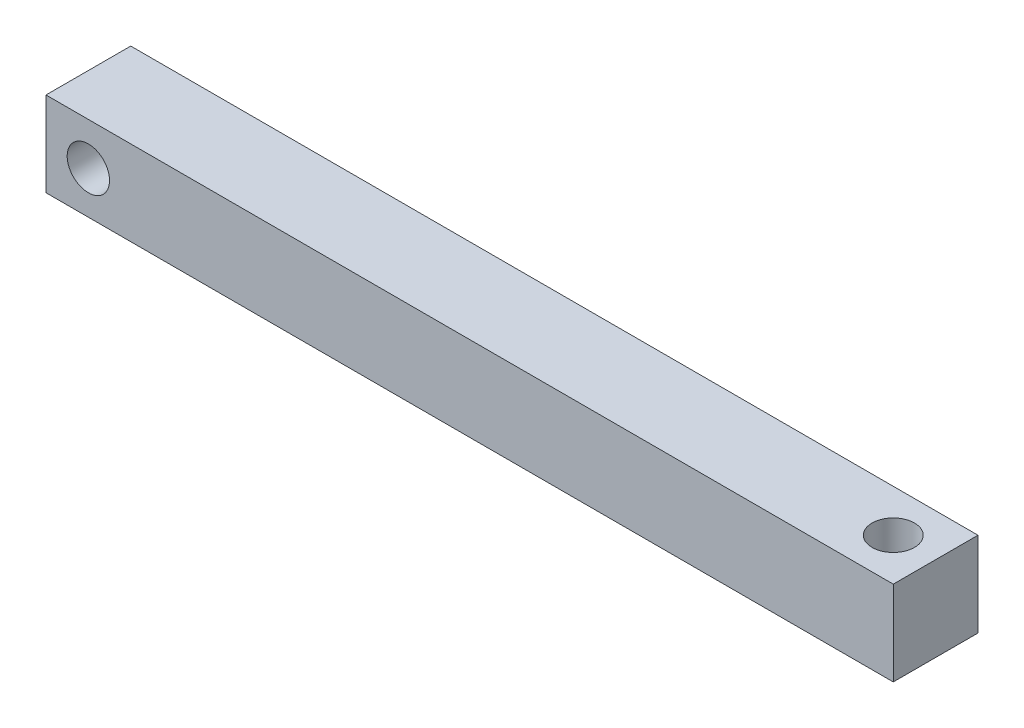
ISO-10303-21;
HEADER;
FILE_DESCRIPTION(('STEP AP214'),'2;1');
FILE_NAME('part.step','',(''),(''),'','','');
FILE_SCHEMA(('AUTOMOTIVE_DESIGN { 1 0 10303 214 1 1 1 1 }'));
ENDSEC;
DATA;
#1=APPLICATION_CONTEXT('core data for automotive mechanical design processes');
#2=APPLICATION_PROTOCOL_DEFINITION('international standard','automotive_design',2000,#1);
#3=PRODUCT_CONTEXT('',#1,'mechanical');
#4=PRODUCT('Part','Part','',(#3));
#5=PRODUCT_RELATED_PRODUCT_CATEGORY('part','',(#4));
#6=PRODUCT_DEFINITION_FORMATION('','',#4);
#7=PRODUCT_DEFINITION_CONTEXT('part definition',#1,'design');
#8=PRODUCT_DEFINITION('design','',#6,#7);
#9=PRODUCT_DEFINITION_SHAPE('','',#8);
#10=(LENGTH_UNIT() NAMED_UNIT(*) SI_UNIT(.MILLI.,.METRE.));
#11=(NAMED_UNIT(*) PLANE_ANGLE_UNIT() SI_UNIT($,.RADIAN.));
#12=(NAMED_UNIT(*) SI_UNIT($,.STERADIAN.) SOLID_ANGLE_UNIT());
#13=UNCERTAINTY_MEASURE_WITH_UNIT(LENGTH_MEASURE(1.E-05),#10,'distance_accuracy_value','');
#14=(GEOMETRIC_REPRESENTATION_CONTEXT(3) GLOBAL_UNCERTAINTY_ASSIGNED_CONTEXT((#13)) GLOBAL_UNIT_ASSIGNED_CONTEXT((#10,
#11,#12)) REPRESENTATION_CONTEXT('',''));
#15=CARTESIAN_POINT('',(0.,0.,0.));
#16=DIRECTION('',(0.,0.,1.));
#17=DIRECTION('',(1.,0.,0.));
#18=AXIS2_PLACEMENT_3D('',#15,#16,#17);
#19=CARTESIAN_POINT('',(100.,10.,20.));
#20=DIRECTION('',(-1.,0.,0.));
#21=DIRECTION('',(0.,-1.,0.));
#22=AXIS2_PLACEMENT_3D('',#19,#20,#21);
#23=PLANE('',#22);
#24=DIRECTION('',(0.,1.,0.));
#25=VECTOR('',#24,1.);
#26=CARTESIAN_POINT('',(100.,10.,0.));
#27=LINE('',#26,#25);
#28=CARTESIAN_POINT('',(100.,-10.,0.));
#29=VERTEX_POINT('',#28);
#30=CARTESIAN_POINT('',(100.,10.,0.));
#31=VERTEX_POINT('',#30);
#32=EDGE_CURVE('E103',#29,#31,#27,.T.);
#33=ORIENTED_EDGE('',*,*,#32,.T.);
#34=DIRECTION('',(0.,0.,-1.));
#35=VECTOR('',#34,1.);
#36=CARTESIAN_POINT('',(100.,10.,20.));
#37=LINE('',#36,#35);
#38=CARTESIAN_POINT('',(100.,10.,20.));
#39=VERTEX_POINT('',#38);
#40=EDGE_CURVE('E11',#39,#31,#37,.T.);
#41=ORIENTED_EDGE('',*,*,#40,.F.);
#42=DIRECTION('',(0.,1.,0.));
#43=VECTOR('',#42,1.);
#44=CARTESIAN_POINT('',(100.,10.,20.));
#45=LINE('',#44,#43);
#46=CARTESIAN_POINT('',(100.,-10.,20.));
#47=VERTEX_POINT('',#46);
#48=EDGE_CURVE('E91',#47,#39,#45,.T.);
#49=ORIENTED_EDGE('',*,*,#48,.F.);
#50=DIRECTION('',(0.,0.,-1.));
#51=VECTOR('',#50,1.);
#52=CARTESIAN_POINT('',(100.,-10.,20.));
#53=LINE('',#52,#51);
#54=EDGE_CURVE('E99',#47,#29,#53,.T.);
#55=ORIENTED_EDGE('',*,*,#54,.T.);
#56=EDGE_LOOP('',(#33,#41,#49,#55));
#57=FACE_BOUND('',#56,.T.);
#58=ADVANCED_FACE('F40',(#57),#23,.F.);
#59=CARTESIAN_POINT('',(-100.,10.,20.));
#60=DIRECTION('',(0.,-1.,0.));
#61=DIRECTION('',(0.,0.,-1.));
#62=AXIS2_PLACEMENT_3D('',#59,#60,#61);
#63=PLANE('',#62);
#64=CARTESIAN_POINT('',(90.,10.,10.));
#65=DIRECTION('',(0.,-1.,0.));
#66=DIRECTION('',(0.,0.,-1.));
#67=AXIS2_PLACEMENT_3D('',#64,#65,#66);
#68=CIRCLE('',#67,4.99999999999999);
#69=CARTESIAN_POINT('',(90.,10.,5.00000000000001));
#70=VERTEX_POINT('',#69);
#71=EDGE_CURVE('E120',#70,#70,#68,.T.);
#72=ORIENTED_EDGE('',*,*,#71,.T.);
#73=EDGE_LOOP('',(#72));
#74=FACE_BOUND('',#73,.T.);
#75=DIRECTION('',(-1.,0.,0.));
#76=VECTOR('',#75,1.);
#77=CARTESIAN_POINT('',(-100.,10.,0.));
#78=LINE('',#77,#76);
#79=CARTESIAN_POINT('',(-100.,10.,0.));
#80=VERTEX_POINT('',#79);
#81=EDGE_CURVE('E95',#31,#80,#78,.T.);
#82=ORIENTED_EDGE('',*,*,#81,.T.);
#83=DIRECTION('',(0.,0.,-1.));
#84=VECTOR('',#83,1.);
#85=CARTESIAN_POINT('',(-100.,10.,20.));
#86=LINE('',#85,#84);
#87=CARTESIAN_POINT('',(-100.,10.,20.));
#88=VERTEX_POINT('',#87);
#89=EDGE_CURVE('E48',#88,#80,#86,.T.);
#90=ORIENTED_EDGE('',*,*,#89,.F.);
#91=DIRECTION('',(-1.,0.,0.));
#92=VECTOR('',#91,1.);
#93=CARTESIAN_POINT('',(-100.,10.,20.));
#94=LINE('',#93,#92);
#95=EDGE_CURVE('E86',#39,#88,#94,.T.);
#96=ORIENTED_EDGE('',*,*,#95,.F.);
#97=ORIENTED_EDGE('',*,*,#40,.T.);
#98=EDGE_LOOP('',(#82,#90,#96,#97));
#99=FACE_BOUND('',#98,.T.);
#100=ADVANCED_FACE('F94',(#74,#99),#63,.F.);
#101=CARTESIAN_POINT('',(-100.,10.,20.));
#102=DIRECTION('',(1.,0.,0.));
#103=DIRECTION('',(0.,0.,-1.));
#104=AXIS2_PLACEMENT_3D('',#101,#102,#103);
#105=PLANE('',#104);
#106=DIRECTION('',(0.,-1.,0.));
#107=VECTOR('',#106,1.);
#108=CARTESIAN_POINT('',(-100.,10.,0.));
#109=LINE('',#108,#107);
#110=CARTESIAN_POINT('',(-100.,-10.,0.));
#111=VERTEX_POINT('',#110);
#112=EDGE_CURVE('E73',#80,#111,#109,.T.);
#113=ORIENTED_EDGE('',*,*,#112,.T.);
#114=DIRECTION('',(0.,0.,-1.));
#115=VECTOR('',#114,1.);
#116=CARTESIAN_POINT('',(-100.,-10.,20.));
#117=LINE('',#116,#115);
#118=CARTESIAN_POINT('',(-100.,-10.,20.));
#119=VERTEX_POINT('',#118);
#120=EDGE_CURVE('E96',#119,#111,#117,.T.);
#121=ORIENTED_EDGE('',*,*,#120,.F.);
#122=DIRECTION('',(0.,-1.,0.));
#123=VECTOR('',#122,1.);
#124=CARTESIAN_POINT('',(-100.,10.,20.));
#125=LINE('',#124,#123);
#126=EDGE_CURVE('E89',#88,#119,#125,.T.);
#127=ORIENTED_EDGE('',*,*,#126,.F.);
#128=ORIENTED_EDGE('',*,*,#89,.T.);
#129=EDGE_LOOP('',(#113,#121,#127,#128));
#130=FACE_BOUND('',#129,.T.);
#131=ADVANCED_FACE('F97',(#130),#105,.F.);
#132=CARTESIAN_POINT('',(-100.,-10.,20.));
#133=DIRECTION('',(0.,1.,0.));
#134=DIRECTION('',(0.,0.,1.));
#135=AXIS2_PLACEMENT_3D('',#132,#133,#134);
#136=PLANE('',#135);
#137=CARTESIAN_POINT('',(90.,-10.,10.));
#138=DIRECTION('',(0.,-1.,0.));
#139=DIRECTION('',(0.,0.,-1.));
#140=AXIS2_PLACEMENT_3D('',#137,#138,#139);
#141=CIRCLE('',#140,4.99999999999999);
#142=CARTESIAN_POINT('',(90.,-10.,5.00000000000001));
#143=VERTEX_POINT('',#142);
#144=EDGE_CURVE('E123',#143,#143,#141,.T.);
#145=ORIENTED_EDGE('',*,*,#144,.F.);
#146=EDGE_LOOP('',(#145));
#147=FACE_BOUND('',#146,.T.);
#148=DIRECTION('',(1.,0.,0.));
#149=VECTOR('',#148,1.);
#150=CARTESIAN_POINT('',(-100.,-10.,0.));
#151=LINE('',#150,#149);
#152=EDGE_CURVE('E79',#111,#29,#151,.T.);
#153=ORIENTED_EDGE('',*,*,#152,.T.);
#154=ORIENTED_EDGE('',*,*,#54,.F.);
#155=DIRECTION('',(1.,0.,0.));
#156=VECTOR('',#155,1.);
#157=CARTESIAN_POINT('',(-100.,-10.,20.));
#158=LINE('',#157,#156);
#159=EDGE_CURVE('E56',#119,#47,#158,.T.);
#160=ORIENTED_EDGE('',*,*,#159,.F.);
#161=ORIENTED_EDGE('',*,*,#120,.T.);
#162=EDGE_LOOP('',(#153,#154,#160,#161));
#163=FACE_BOUND('',#162,.T.);
#164=ADVANCED_FACE('F111',(#147,#163),#136,.F.);
#165=CARTESIAN_POINT('',(0.,0.,20.));
#166=DIRECTION('',(0.,0.,1.));
#167=DIRECTION('',(1.,0.,0.));
#168=AXIS2_PLACEMENT_3D('',#165,#166,#167);
#169=PLANE('',#168);
#170=CARTESIAN_POINT('',(-90.,0.,20.));
#171=DIRECTION('',(0.,0.,1.));
#172=DIRECTION('',(1.,0.,0.));
#173=AXIS2_PLACEMENT_3D('',#170,#171,#172);
#174=CIRCLE('',#173,5.);
#175=CARTESIAN_POINT('',(-85.,0.,20.));
#176=VERTEX_POINT('',#175);
#177=EDGE_CURVE('E117',#176,#176,#174,.T.);
#178=ORIENTED_EDGE('',*,*,#177,.F.);
#179=EDGE_LOOP('',(#178));
#180=FACE_BOUND('',#179,.T.);
#181=ORIENTED_EDGE('',*,*,#48,.T.);
#182=ORIENTED_EDGE('',*,*,#95,.T.);
#183=ORIENTED_EDGE('',*,*,#126,.T.);
#184=ORIENTED_EDGE('',*,*,#159,.T.);
#185=EDGE_LOOP('',(#181,#182,#183,#184));
#186=FACE_BOUND('',#185,.T.);
#187=ADVANCED_FACE('F87',(#180,#186),#169,.T.);
#188=CARTESIAN_POINT('',(0.,0.,0.));
#189=DIRECTION('',(0.,0.,1.));
#190=DIRECTION('',(1.,0.,0.));
#191=AXIS2_PLACEMENT_3D('',#188,#189,#190);
#192=PLANE('',#191);
#193=CARTESIAN_POINT('',(-90.,0.,0.));
#194=DIRECTION('',(0.,0.,1.));
#195=DIRECTION('',(1.,0.,0.));
#196=AXIS2_PLACEMENT_3D('',#193,#194,#195);
#197=CIRCLE('',#196,5.);
#198=CARTESIAN_POINT('',(-85.,0.,0.));
#199=VERTEX_POINT('',#198);
#200=EDGE_CURVE('E106',#199,#199,#197,.T.);
#201=ORIENTED_EDGE('',*,*,#200,.T.);
#202=EDGE_LOOP('',(#201));
#203=FACE_BOUND('',#202,.T.);
#204=ORIENTED_EDGE('',*,*,#32,.F.);
#205=ORIENTED_EDGE('',*,*,#152,.F.);
#206=ORIENTED_EDGE('',*,*,#112,.F.);
#207=ORIENTED_EDGE('',*,*,#81,.F.);
#208=EDGE_LOOP('',(#204,#205,#206,#207));
#209=FACE_BOUND('',#208,.T.);
#210=ADVANCED_FACE('F114',(#203,#209),#192,.F.);
#211=CARTESIAN_POINT('',(-90.,0.,0.));
#212=DIRECTION('',(0.,0.,1.));
#213=DIRECTION('',(1.,0.,0.));
#214=AXIS2_PLACEMENT_3D('',#211,#212,#213);
#215=CYLINDRICAL_SURFACE('',#214,5.);
#216=ORIENTED_EDGE('',*,*,#200,.F.);
#217=EDGE_LOOP('',(#216));
#218=FACE_BOUND('',#217,.T.);
#219=ORIENTED_EDGE('',*,*,#177,.T.);
#220=EDGE_LOOP('',(#219));
#221=FACE_BOUND('',#220,.T.);
#222=ADVANCED_FACE('F133',(#218,#221),#215,.F.);
#223=CARTESIAN_POINT('',(90.,10.,10.));
#224=DIRECTION('',(0.,-1.,0.));
#225=DIRECTION('',(0.,0.,-1.));
#226=AXIS2_PLACEMENT_3D('',#223,#224,#225);
#227=CYLINDRICAL_SURFACE('',#226,4.99999999999999);
#228=ORIENTED_EDGE('',*,*,#71,.F.);
#229=EDGE_LOOP('',(#228));
#230=FACE_BOUND('',#229,.T.);
#231=ORIENTED_EDGE('',*,*,#144,.T.);
#232=EDGE_LOOP('',(#231));
#233=FACE_BOUND('',#232,.T.);
#234=ADVANCED_FACE('F130',(#230,#233),#227,.F.);
#235=CLOSED_SHELL('',(#58,#100,#131,#164,#187,#210,#222,#234));
#236=MANIFOLD_SOLID_BREP('B2',#235);
#237=ADVANCED_BREP_SHAPE_REPRESENTATION('',(#18,#236),#14);
#238=SHAPE_DEFINITION_REPRESENTATION(#9,#237);
ENDSEC;
END-ISO-10303-21;
